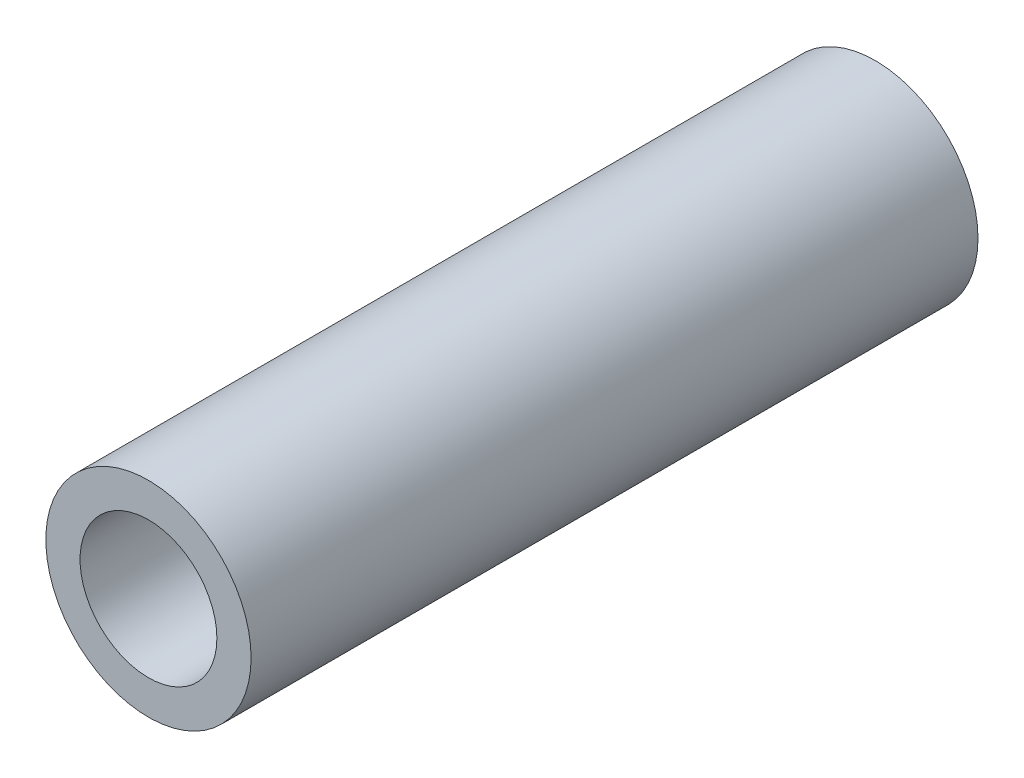
ISO-10303-21;
HEADER;
FILE_DESCRIPTION(('STEP AP214'),'2;1');
FILE_NAME('part.step','',(''),(''),'','','');
FILE_SCHEMA(('AUTOMOTIVE_DESIGN { 1 0 10303 214 1 1 1 1 }'));
ENDSEC;
DATA;
#1=APPLICATION_CONTEXT('core data for automotive mechanical design processes');
#2=APPLICATION_PROTOCOL_DEFINITION('international standard','automotive_design',2000,#1);
#3=PRODUCT_CONTEXT('',#1,'mechanical');
#4=PRODUCT('Part','Part','',(#3));
#5=PRODUCT_RELATED_PRODUCT_CATEGORY('part','',(#4));
#6=PRODUCT_DEFINITION_FORMATION('','',#4);
#7=PRODUCT_DEFINITION_CONTEXT('part definition',#1,'design');
#8=PRODUCT_DEFINITION('design','',#6,#7);
#9=PRODUCT_DEFINITION_SHAPE('','',#8);
#10=(LENGTH_UNIT() NAMED_UNIT(*) SI_UNIT(.MILLI.,.METRE.));
#11=(NAMED_UNIT(*) PLANE_ANGLE_UNIT() SI_UNIT($,.RADIAN.));
#12=(NAMED_UNIT(*) SI_UNIT($,.STERADIAN.) SOLID_ANGLE_UNIT());
#13=UNCERTAINTY_MEASURE_WITH_UNIT(LENGTH_MEASURE(1.E-05),#10,'distance_accuracy_value','');
#14=(GEOMETRIC_REPRESENTATION_CONTEXT(3) GLOBAL_UNCERTAINTY_ASSIGNED_CONTEXT((#13)) GLOBAL_UNIT_ASSIGNED_CONTEXT((#10,
#11,#12)) REPRESENTATION_CONTEXT('',''));
#15=CARTESIAN_POINT('',(0.,0.,0.));
#16=DIRECTION('',(0.,0.,1.));
#17=DIRECTION('',(1.,0.,0.));
#18=AXIS2_PLACEMENT_3D('',#15,#16,#17);
#19=CARTESIAN_POINT('',(0.,0.,10.625));
#20=DIRECTION('',(0.,0.,1.));
#21=DIRECTION('',(1.,0.,0.));
#22=AXIS2_PLACEMENT_3D('',#19,#20,#21);
#23=CYLINDRICAL_SURFACE('',#22,2.);
#24=CARTESIAN_POINT('',(0.,0.,0.));
#25=DIRECTION('',(0.,0.,1.));
#26=DIRECTION('',(1.,0.,0.));
#27=AXIS2_PLACEMENT_3D('',#24,#25,#26);
#28=CIRCLE('',#27,2.);
#29=CARTESIAN_POINT('',(2.,0.,0.));
#30=VERTEX_POINT('',#29);
#31=EDGE_CURVE('E18',#30,#30,#28,.F.);
#32=ORIENTED_EDGE('',*,*,#31,.T.);
#33=EDGE_LOOP('',(#32));
#34=FACE_BOUND('',#33,.T.);
#35=CARTESIAN_POINT('',(0.,0.,21.25));
#36=DIRECTION('',(0.,0.,1.));
#37=DIRECTION('',(1.,0.,0.));
#38=AXIS2_PLACEMENT_3D('',#35,#36,#37);
#39=CIRCLE('',#38,2.);
#40=CARTESIAN_POINT('',(2.,0.,21.25));
#41=VERTEX_POINT('',#40);
#42=EDGE_CURVE('E27',#41,#41,#39,.F.);
#43=ORIENTED_EDGE('',*,*,#42,.F.);
#44=EDGE_LOOP('',(#43));
#45=FACE_BOUND('',#44,.T.);
#46=ADVANCED_FACE('F15',(#34,#45),#23,.F.);
#47=CARTESIAN_POINT('',(0.,0.,0.));
#48=DIRECTION('',(0.,0.,1.));
#49=DIRECTION('',(1.,0.,0.));
#50=AXIS2_PLACEMENT_3D('',#47,#48,#49);
#51=PLANE('',#50);
#52=ORIENTED_EDGE('',*,*,#31,.F.);
#53=EDGE_LOOP('',(#52));
#54=FACE_BOUND('',#53,.T.);
#55=CARTESIAN_POINT('',(0.,0.,0.));
#56=DIRECTION('',(0.,0.,1.));
#57=DIRECTION('',(1.,0.,0.));
#58=AXIS2_PLACEMENT_3D('',#55,#56,#57);
#59=CIRCLE('',#58,3.);
#60=CARTESIAN_POINT('',(3.,0.,0.));
#61=VERTEX_POINT('',#60);
#62=EDGE_CURVE('E22',#61,#61,#59,.T.);
#63=ORIENTED_EDGE('',*,*,#62,.F.);
#64=EDGE_LOOP('',(#63));
#65=FACE_BOUND('',#64,.T.);
#66=ADVANCED_FACE('F37',(#54,#65),#51,.F.);
#67=CARTESIAN_POINT('',(0.,0.,21.25));
#68=DIRECTION('',(0.,0.,1.));
#69=DIRECTION('',(1.,0.,0.));
#70=AXIS2_PLACEMENT_3D('',#67,#68,#69);
#71=PLANE('',#70);
#72=ORIENTED_EDGE('',*,*,#42,.T.);
#73=EDGE_LOOP('',(#72));
#74=FACE_BOUND('',#73,.T.);
#75=CARTESIAN_POINT('',(0.,0.,21.25));
#76=DIRECTION('',(0.,0.,1.));
#77=DIRECTION('',(1.,0.,0.));
#78=AXIS2_PLACEMENT_3D('',#75,#76,#77);
#79=CIRCLE('',#78,3.);
#80=CARTESIAN_POINT('',(3.,0.,21.25));
#81=VERTEX_POINT('',#80);
#82=EDGE_CURVE('E10',#81,#81,#79,.F.);
#83=ORIENTED_EDGE('',*,*,#82,.F.);
#84=EDGE_LOOP('',(#83));
#85=FACE_BOUND('',#84,.T.);
#86=ADVANCED_FACE('F40',(#74,#85),#71,.T.);
#87=CARTESIAN_POINT('',(0.,0.,10.625));
#88=DIRECTION('',(0.,0.,1.));
#89=DIRECTION('',(1.,0.,0.));
#90=AXIS2_PLACEMENT_3D('',#87,#88,#89);
#91=CYLINDRICAL_SURFACE('',#90,3.);
#92=ORIENTED_EDGE('',*,*,#62,.T.);
#93=EDGE_LOOP('',(#92));
#94=FACE_BOUND('',#93,.T.);
#95=ORIENTED_EDGE('',*,*,#82,.T.);
#96=EDGE_LOOP('',(#95));
#97=FACE_BOUND('',#96,.T.);
#98=ADVANCED_FACE('F43',(#94,#97),#91,.T.);
#99=CLOSED_SHELL('',(#46,#66,#86,#98));
#100=MANIFOLD_SOLID_BREP('B1',#99);
#101=ADVANCED_BREP_SHAPE_REPRESENTATION('',(#18,#100),#14);
#102=SHAPE_DEFINITION_REPRESENTATION(#9,#101);
ENDSEC;
END-ISO-10303-21;
